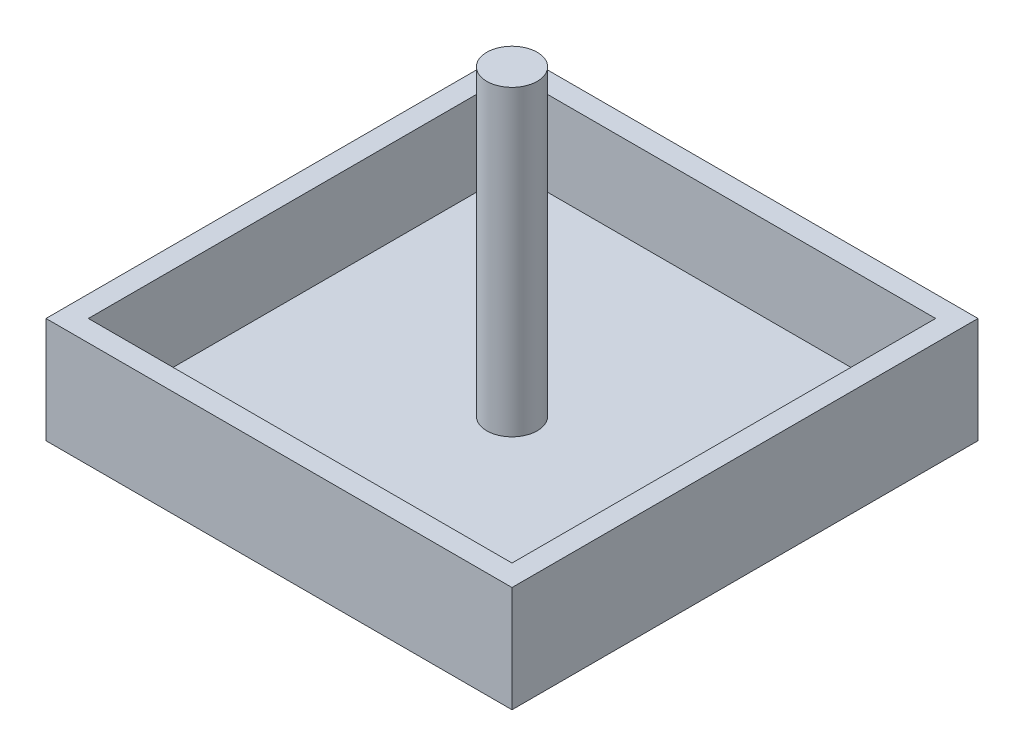
ISO-10303-21;
HEADER;
FILE_DESCRIPTION(('STEP AP214'),'2;1');
FILE_NAME('part.step','',(''),(''),'','','');
FILE_SCHEMA(('AUTOMOTIVE_DESIGN { 1 0 10303 214 1 1 1 1 }'));
ENDSEC;
DATA;
#1=APPLICATION_CONTEXT('core data for automotive mechanical design processes');
#2=APPLICATION_PROTOCOL_DEFINITION('international standard','automotive_design',2000,#1);
#3=PRODUCT_CONTEXT('',#1,'mechanical');
#4=PRODUCT('Part','Part','',(#3));
#5=PRODUCT_RELATED_PRODUCT_CATEGORY('part','',(#4));
#6=PRODUCT_DEFINITION_FORMATION('','',#4);
#7=PRODUCT_DEFINITION_CONTEXT('part definition',#1,'design');
#8=PRODUCT_DEFINITION('design','',#6,#7);
#9=PRODUCT_DEFINITION_SHAPE('','',#8);
#10=(LENGTH_UNIT() NAMED_UNIT(*) SI_UNIT(.MILLI.,.METRE.));
#11=(NAMED_UNIT(*) PLANE_ANGLE_UNIT() SI_UNIT($,.RADIAN.));
#12=(NAMED_UNIT(*) SI_UNIT($,.STERADIAN.) SOLID_ANGLE_UNIT());
#13=UNCERTAINTY_MEASURE_WITH_UNIT(LENGTH_MEASURE(1.E-05),#10,'distance_accuracy_value','');
#14=(GEOMETRIC_REPRESENTATION_CONTEXT(3) GLOBAL_UNCERTAINTY_ASSIGNED_CONTEXT((#13)) GLOBAL_UNIT_ASSIGNED_CONTEXT((#10,
#11,#12)) REPRESENTATION_CONTEXT('',''));
#15=CARTESIAN_POINT('',(0.,0.,0.));
#16=DIRECTION('',(0.,0.,1.));
#17=DIRECTION('',(1.,0.,0.));
#18=AXIS2_PLACEMENT_3D('',#15,#16,#17);
#19=CARTESIAN_POINT('',(0.,2.,0.));
#20=DIRECTION('',(0.,1.,0.));
#21=DIRECTION('',(0.,0.,1.));
#22=AXIS2_PLACEMENT_3D('',#19,#20,#21);
#23=PLANE('',#22);
#24=CARTESIAN_POINT('',(-15.0120625328481,2.,15.0120625328481));
#25=DIRECTION('',(0.,1.,0.));
#26=DIRECTION('',(0.,0.,1.));
#27=AXIS2_PLACEMENT_3D('',#24,#25,#26);
#28=CIRCLE('',#27,2.38);
#29=CARTESIAN_POINT('',(-15.0120625328481,2.,17.3920625328481));
#30=VERTEX_POINT('',#29);
#31=EDGE_CURVE('E132',#30,#30,#28,.T.);
#32=ORIENTED_EDGE('',*,*,#31,.F.);
#33=EDGE_LOOP('',(#32));
#34=FACE_BOUND('',#33,.T.);
#35=DIRECTION('',(0.,0.,1.));
#36=VECTOR('',#35,1.);
#37=CARTESIAN_POINT('',(-35.0120625328481,2.,-4.98793746715188));
#38=LINE('',#37,#36);
#39=CARTESIAN_POINT('',(-35.0120625328481,2.,-4.98793746715188));
#40=VERTEX_POINT('',#39);
#41=CARTESIAN_POINT('',(-35.0120625328481,2.,35.0120625328481));
#42=VERTEX_POINT('',#41);
#43=EDGE_CURVE('E55',#40,#42,#38,.T.);
#44=ORIENTED_EDGE('',*,*,#43,.T.);
#45=DIRECTION('',(1.,0.,0.));
#46=VECTOR('',#45,1.);
#47=CARTESIAN_POINT('',(-35.0120625328481,2.,35.0120625328481));
#48=LINE('',#47,#46);
#49=CARTESIAN_POINT('',(4.98793746715186,2.,35.0120625328481));
#50=VERTEX_POINT('',#49);
#51=EDGE_CURVE('E165',#42,#50,#48,.T.);
#52=ORIENTED_EDGE('',*,*,#51,.T.);
#53=DIRECTION('',(0.,0.,-1.));
#54=VECTOR('',#53,1.);
#55=CARTESIAN_POINT('',(4.98793746715186,2.,-4.98793746715188));
#56=LINE('',#55,#54);
#57=CARTESIAN_POINT('',(4.98793746715186,2.,-4.98793746715188));
#58=VERTEX_POINT('',#57);
#59=EDGE_CURVE('E40',#50,#58,#56,.T.);
#60=ORIENTED_EDGE('',*,*,#59,.T.);
#61=DIRECTION('',(-1.,0.,0.));
#62=VECTOR('',#61,1.);
#63=CARTESIAN_POINT('',(-35.0120625328481,2.,-4.98793746715188));
#64=LINE('',#63,#62);
#65=EDGE_CURVE('E11',#58,#40,#64,.T.);
#66=ORIENTED_EDGE('',*,*,#65,.T.);
#67=EDGE_LOOP('',(#44,#52,#60,#66));
#68=FACE_BOUND('',#67,.T.);
#69=ADVANCED_FACE('F32',(#34,#68),#23,.T.);
#70=CARTESIAN_POINT('',(-35.0120625328481,10.,0.));
#71=DIRECTION('',(-1.,0.,0.));
#72=DIRECTION('',(0.,0.,1.));
#73=AXIS2_PLACEMENT_3D('',#70,#71,#72);
#74=PLANE('',#73);
#75=ORIENTED_EDGE('',*,*,#43,.F.);
#76=DIRECTION('',(0.,-1.,0.));
#77=VECTOR('',#76,1.);
#78=CARTESIAN_POINT('',(-35.0120625328481,10.,-4.98793746715188));
#79=LINE('',#78,#77);
#80=CARTESIAN_POINT('',(-35.0120625328481,10.,-4.98793746715188));
#81=VERTEX_POINT('',#80);
#82=EDGE_CURVE('E151',#81,#40,#79,.T.);
#83=ORIENTED_EDGE('',*,*,#82,.F.);
#84=DIRECTION('',(0.,0.,-1.));
#85=VECTOR('',#84,1.);
#86=CARTESIAN_POINT('',(-35.0120625328481,10.,0.));
#87=LINE('',#86,#85);
#88=CARTESIAN_POINT('',(-35.0120625328481,10.,35.0120625328481));
#89=VERTEX_POINT('',#88);
#90=EDGE_CURVE('E138',#89,#81,#87,.T.);
#91=ORIENTED_EDGE('',*,*,#90,.F.);
#92=DIRECTION('',(0.,-1.,0.));
#93=VECTOR('',#92,1.);
#94=CARTESIAN_POINT('',(-35.0120625328481,10.,35.0120625328481));
#95=LINE('',#94,#93);
#96=EDGE_CURVE('E157',#89,#42,#95,.T.);
#97=ORIENTED_EDGE('',*,*,#96,.T.);
#98=EDGE_LOOP('',(#75,#83,#91,#97));
#99=FACE_BOUND('',#98,.T.);
#100=ADVANCED_FACE('F176',(#99),#74,.F.);
#101=CARTESIAN_POINT('',(0.,10.,-4.98793746715188));
#102=DIRECTION('',(0.,0.,-1.));
#103=DIRECTION('',(-1.,0.,0.));
#104=AXIS2_PLACEMENT_3D('',#101,#102,#103);
#105=PLANE('',#104);
#106=ORIENTED_EDGE('',*,*,#65,.F.);
#107=DIRECTION('',(0.,-1.,0.));
#108=VECTOR('',#107,1.);
#109=CARTESIAN_POINT('',(4.98793746715186,10.,-4.98793746715188));
#110=LINE('',#109,#108);
#111=CARTESIAN_POINT('',(4.98793746715186,10.,-4.98793746715188));
#112=VERTEX_POINT('',#111);
#113=EDGE_CURVE('E153',#112,#58,#110,.T.);
#114=ORIENTED_EDGE('',*,*,#113,.F.);
#115=DIRECTION('',(1.,0.,0.));
#116=VECTOR('',#115,1.);
#117=CARTESIAN_POINT('',(0.,10.,-4.98793746715188));
#118=LINE('',#117,#116);
#119=EDGE_CURVE('E122',#81,#112,#118,.T.);
#120=ORIENTED_EDGE('',*,*,#119,.F.);
#121=ORIENTED_EDGE('',*,*,#82,.T.);
#122=EDGE_LOOP('',(#106,#114,#120,#121));
#123=FACE_BOUND('',#122,.T.);
#124=ADVANCED_FACE('F174',(#123),#105,.F.);
#125=CARTESIAN_POINT('',(4.98793746715186,10.,0.));
#126=DIRECTION('',(1.,0.,0.));
#127=DIRECTION('',(0.,0.,-1.));
#128=AXIS2_PLACEMENT_3D('',#125,#126,#127);
#129=PLANE('',#128);
#130=ORIENTED_EDGE('',*,*,#59,.F.);
#131=DIRECTION('',(0.,-1.,0.));
#132=VECTOR('',#131,1.);
#133=CARTESIAN_POINT('',(4.98793746715186,10.,35.0120625328481));
#134=LINE('',#133,#132);
#135=CARTESIAN_POINT('',(4.98793746715186,10.,35.0120625328481));
#136=VERTEX_POINT('',#135);
#137=EDGE_CURVE('E47',#136,#50,#134,.T.);
#138=ORIENTED_EDGE('',*,*,#137,.F.);
#139=DIRECTION('',(0.,0.,1.));
#140=VECTOR('',#139,1.);
#141=CARTESIAN_POINT('',(4.98793746715186,10.,0.));
#142=LINE('',#141,#140);
#143=EDGE_CURVE('E143',#112,#136,#142,.T.);
#144=ORIENTED_EDGE('',*,*,#143,.F.);
#145=ORIENTED_EDGE('',*,*,#113,.T.);
#146=EDGE_LOOP('',(#130,#138,#144,#145));
#147=FACE_BOUND('',#146,.T.);
#148=ADVANCED_FACE('F170',(#147),#129,.F.);
#149=CARTESIAN_POINT('',(-37.0120625328481,10.,0.));
#150=DIRECTION('',(1.,0.,0.));
#151=DIRECTION('',(0.,0.,-1.));
#152=AXIS2_PLACEMENT_3D('',#149,#150,#151);
#153=PLANE('',#152);
#154=DIRECTION('',(0.,0.,1.));
#155=VECTOR('',#154,1.);
#156=CARTESIAN_POINT('',(-37.0120625328481,0.,0.));
#157=LINE('',#156,#155);
#158=CARTESIAN_POINT('',(-37.0120625328481,0.,-6.98793746715188));
#159=VERTEX_POINT('',#158);
#160=CARTESIAN_POINT('',(-37.0120625328481,0.,37.0120625328481));
#161=VERTEX_POINT('',#160);
#162=EDGE_CURVE('E146',#159,#161,#157,.T.);
#163=ORIENTED_EDGE('',*,*,#162,.T.);
#164=DIRECTION('',(0.,-1.,0.));
#165=VECTOR('',#164,1.);
#166=CARTESIAN_POINT('',(-37.0120625328481,10.,37.0120625328481));
#167=LINE('',#166,#165);
#168=CARTESIAN_POINT('',(-37.0120625328481,10.,37.0120625328481));
#169=VERTEX_POINT('',#168);
#170=EDGE_CURVE('E126',#169,#161,#167,.T.);
#171=ORIENTED_EDGE('',*,*,#170,.F.);
#172=DIRECTION('',(0.,0.,1.));
#173=VECTOR('',#172,1.);
#174=CARTESIAN_POINT('',(-37.0120625328481,10.,0.));
#175=LINE('',#174,#173);
#176=CARTESIAN_POINT('',(-37.0120625328481,10.,-6.98793746715188));
#177=VERTEX_POINT('',#176);
#178=EDGE_CURVE('E105',#177,#169,#175,.T.);
#179=ORIENTED_EDGE('',*,*,#178,.F.);
#180=DIRECTION('',(0.,-1.,0.));
#181=VECTOR('',#180,1.);
#182=CARTESIAN_POINT('',(-37.0120625328481,10.,-6.98793746715188));
#183=LINE('',#182,#181);
#184=EDGE_CURVE('E114',#177,#159,#183,.T.);
#185=ORIENTED_EDGE('',*,*,#184,.T.);
#186=EDGE_LOOP('',(#163,#171,#179,#185));
#187=FACE_BOUND('',#186,.T.);
#188=ADVANCED_FACE('F124',(#187),#153,.F.);
#189=CARTESIAN_POINT('',(0.,10.,37.0120625328481));
#190=DIRECTION('',(0.,0.,-1.));
#191=DIRECTION('',(-1.,0.,0.));
#192=AXIS2_PLACEMENT_3D('',#189,#190,#191);
#193=PLANE('',#192);
#194=DIRECTION('',(1.,0.,0.));
#195=VECTOR('',#194,1.);
#196=CARTESIAN_POINT('',(0.,0.,37.0120625328481));
#197=LINE('',#196,#195);
#198=CARTESIAN_POINT('',(6.98793746715186,0.,37.0120625328481));
#199=VERTEX_POINT('',#198);
#200=EDGE_CURVE('E127',#161,#199,#197,.T.);
#201=ORIENTED_EDGE('',*,*,#200,.T.);
#202=DIRECTION('',(0.,-1.,0.));
#203=VECTOR('',#202,1.);
#204=CARTESIAN_POINT('',(6.98793746715186,10.,37.0120625328481));
#205=LINE('',#204,#203);
#206=CARTESIAN_POINT('',(6.98793746715186,10.,37.0120625328481));
#207=VERTEX_POINT('',#206);
#208=EDGE_CURVE('E160',#207,#199,#205,.T.);
#209=ORIENTED_EDGE('',*,*,#208,.F.);
#210=DIRECTION('',(1.,0.,0.));
#211=VECTOR('',#210,1.);
#212=CARTESIAN_POINT('',(0.,10.,37.0120625328481));
#213=LINE('',#212,#211);
#214=EDGE_CURVE('E136',#169,#207,#213,.T.);
#215=ORIENTED_EDGE('',*,*,#214,.F.);
#216=ORIENTED_EDGE('',*,*,#170,.T.);
#217=EDGE_LOOP('',(#201,#209,#215,#216));
#218=FACE_BOUND('',#217,.T.);
#219=ADVANCED_FACE('F198',(#218),#193,.F.);
#220=CARTESIAN_POINT('',(6.98793746715185,10.,0.));
#221=DIRECTION('',(-1.,0.,0.));
#222=DIRECTION('',(0.,0.,1.));
#223=AXIS2_PLACEMENT_3D('',#220,#221,#222);
#224=PLANE('',#223);
#225=DIRECTION('',(0.,0.,-1.));
#226=VECTOR('',#225,1.);
#227=CARTESIAN_POINT('',(6.98793746715185,0.,0.));
#228=LINE('',#227,#226);
#229=CARTESIAN_POINT('',(6.98793746715186,0.,-6.98793746715188));
#230=VERTEX_POINT('',#229);
#231=EDGE_CURVE('E129',#199,#230,#228,.T.);
#232=ORIENTED_EDGE('',*,*,#231,.T.);
#233=DIRECTION('',(0.,-1.,0.));
#234=VECTOR('',#233,1.);
#235=CARTESIAN_POINT('',(6.98793746715186,10.,-6.98793746715188));
#236=LINE('',#235,#234);
#237=CARTESIAN_POINT('',(6.98793746715186,10.,-6.98793746715188));
#238=VERTEX_POINT('',#237);
#239=EDGE_CURVE('E121',#238,#230,#236,.T.);
#240=ORIENTED_EDGE('',*,*,#239,.F.);
#241=DIRECTION('',(0.,0.,-1.));
#242=VECTOR('',#241,1.);
#243=CARTESIAN_POINT('',(6.98793746715185,10.,0.));
#244=LINE('',#243,#242);
#245=EDGE_CURVE('E108',#207,#238,#244,.T.);
#246=ORIENTED_EDGE('',*,*,#245,.F.);
#247=ORIENTED_EDGE('',*,*,#208,.T.);
#248=EDGE_LOOP('',(#232,#240,#246,#247));
#249=FACE_BOUND('',#248,.T.);
#250=ADVANCED_FACE('F186',(#249),#224,.F.);
#251=CARTESIAN_POINT('',(0.,10.,-6.9879374671518));
#252=DIRECTION('',(0.,0.,1.));
#253=DIRECTION('',(1.,0.,0.));
#254=AXIS2_PLACEMENT_3D('',#251,#252,#253);
#255=PLANE('',#254);
#256=DIRECTION('',(-1.,0.,0.));
#257=VECTOR('',#256,1.);
#258=CARTESIAN_POINT('',(0.,0.,-6.9879374671518));
#259=LINE('',#258,#257);
#260=EDGE_CURVE('E117',#230,#159,#259,.T.);
#261=ORIENTED_EDGE('',*,*,#260,.T.);
#262=ORIENTED_EDGE('',*,*,#184,.F.);
#263=DIRECTION('',(-1.,0.,0.));
#264=VECTOR('',#263,1.);
#265=CARTESIAN_POINT('',(0.,10.,-6.9879374671518));
#266=LINE('',#265,#264);
#267=EDGE_CURVE('E100',#238,#177,#266,.T.);
#268=ORIENTED_EDGE('',*,*,#267,.F.);
#269=ORIENTED_EDGE('',*,*,#239,.T.);
#270=EDGE_LOOP('',(#261,#262,#268,#269));
#271=FACE_BOUND('',#270,.T.);
#272=ADVANCED_FACE('F115',(#271),#255,.F.);
#273=CARTESIAN_POINT('',(0.,10.,35.0120625328481));
#274=DIRECTION('',(0.,0.,1.));
#275=DIRECTION('',(1.,0.,0.));
#276=AXIS2_PLACEMENT_3D('',#273,#274,#275);
#277=PLANE('',#276);
#278=ORIENTED_EDGE('',*,*,#51,.F.);
#279=ORIENTED_EDGE('',*,*,#96,.F.);
#280=DIRECTION('',(-1.,0.,0.));
#281=VECTOR('',#280,1.);
#282=CARTESIAN_POINT('',(0.,10.,35.0120625328481));
#283=LINE('',#282,#281);
#284=EDGE_CURVE('E141',#136,#89,#283,.T.);
#285=ORIENTED_EDGE('',*,*,#284,.F.);
#286=ORIENTED_EDGE('',*,*,#137,.T.);
#287=EDGE_LOOP('',(#278,#279,#285,#286));
#288=FACE_BOUND('',#287,.T.);
#289=ADVANCED_FACE('F178',(#288),#277,.F.);
#290=CARTESIAN_POINT('',(0.,10.,0.));
#291=DIRECTION('',(0.,-1.,0.));
#292=DIRECTION('',(0.,0.,-1.));
#293=AXIS2_PLACEMENT_3D('',#290,#291,#292);
#294=PLANE('',#293);
#295=ORIENTED_EDGE('',*,*,#178,.T.);
#296=ORIENTED_EDGE('',*,*,#214,.T.);
#297=ORIENTED_EDGE('',*,*,#245,.T.);
#298=ORIENTED_EDGE('',*,*,#267,.T.);
#299=EDGE_LOOP('',(#295,#296,#297,#298));
#300=FACE_BOUND('',#299,.T.);
#301=ORIENTED_EDGE('',*,*,#90,.T.);
#302=ORIENTED_EDGE('',*,*,#119,.T.);
#303=ORIENTED_EDGE('',*,*,#143,.T.);
#304=ORIENTED_EDGE('',*,*,#284,.T.);
#305=EDGE_LOOP('',(#301,#302,#303,#304));
#306=FACE_BOUND('',#305,.T.);
#307=ADVANCED_FACE('F102',(#300,#306),#294,.F.);
#308=CARTESIAN_POINT('',(0.,0.,0.));
#309=DIRECTION('',(0.,1.,0.));
#310=DIRECTION('',(0.,0.,1.));
#311=AXIS2_PLACEMENT_3D('',#308,#309,#310);
#312=PLANE('',#311);
#313=ORIENTED_EDGE('',*,*,#162,.F.);
#314=ORIENTED_EDGE('',*,*,#260,.F.);
#315=ORIENTED_EDGE('',*,*,#231,.F.);
#316=ORIENTED_EDGE('',*,*,#200,.F.);
#317=EDGE_LOOP('',(#313,#314,#315,#316));
#318=FACE_BOUND('',#317,.T.);
#319=ADVANCED_FACE('F34',(#318),#312,.F.);
#320=CARTESIAN_POINT('',(-15.0120625328481,30.58,15.0120625328481));
#321=DIRECTION('',(0.,-1.,0.));
#322=DIRECTION('',(0.,0.,-1.));
#323=AXIS2_PLACEMENT_3D('',#320,#321,#322);
#324=CYLINDRICAL_SURFACE('',#323,2.38);
#325=CARTESIAN_POINT('',(-15.0120625328481,30.58,15.0120625328481));
#326=DIRECTION('',(0.,1.,0.));
#327=DIRECTION('',(0.,0.,1.));
#328=AXIS2_PLACEMENT_3D('',#325,#326,#327);
#329=CIRCLE('',#328,2.38);
#330=CARTESIAN_POINT('',(-15.0120625328481,30.58,17.3920625328481));
#331=VERTEX_POINT('',#330);
#332=EDGE_CURVE('E148',#331,#331,#329,.T.);
#333=ORIENTED_EDGE('',*,*,#332,.F.);
#334=EDGE_LOOP('',(#333));
#335=FACE_BOUND('',#334,.T.);
#336=ORIENTED_EDGE('',*,*,#31,.T.);
#337=EDGE_LOOP('',(#336));
#338=FACE_BOUND('',#337,.T.);
#339=ADVANCED_FACE('F211',(#335,#338),#324,.T.);
#340=CARTESIAN_POINT('',(-15.0120625328481,30.58,15.0120625328481));
#341=DIRECTION('',(0.,1.,0.));
#342=DIRECTION('',(0.,0.,1.));
#343=AXIS2_PLACEMENT_3D('',#340,#341,#342);
#344=PLANE('',#343);
#345=ORIENTED_EDGE('',*,*,#332,.T.);
#346=EDGE_LOOP('',(#345));
#347=FACE_BOUND('',#346,.T.);
#348=ADVANCED_FACE('F215',(#347),#344,.T.);
#349=CLOSED_SHELL('',(#69,#100,#124,#148,#188,#219,#250,#272,#289,#307,#319,#339,#348));
#350=MANIFOLD_SOLID_BREP('B2',#349);
#351=ADVANCED_BREP_SHAPE_REPRESENTATION('',(#18,#350),#14);
#352=SHAPE_DEFINITION_REPRESENTATION(#9,#351);
ENDSEC;
END-ISO-10303-21;
